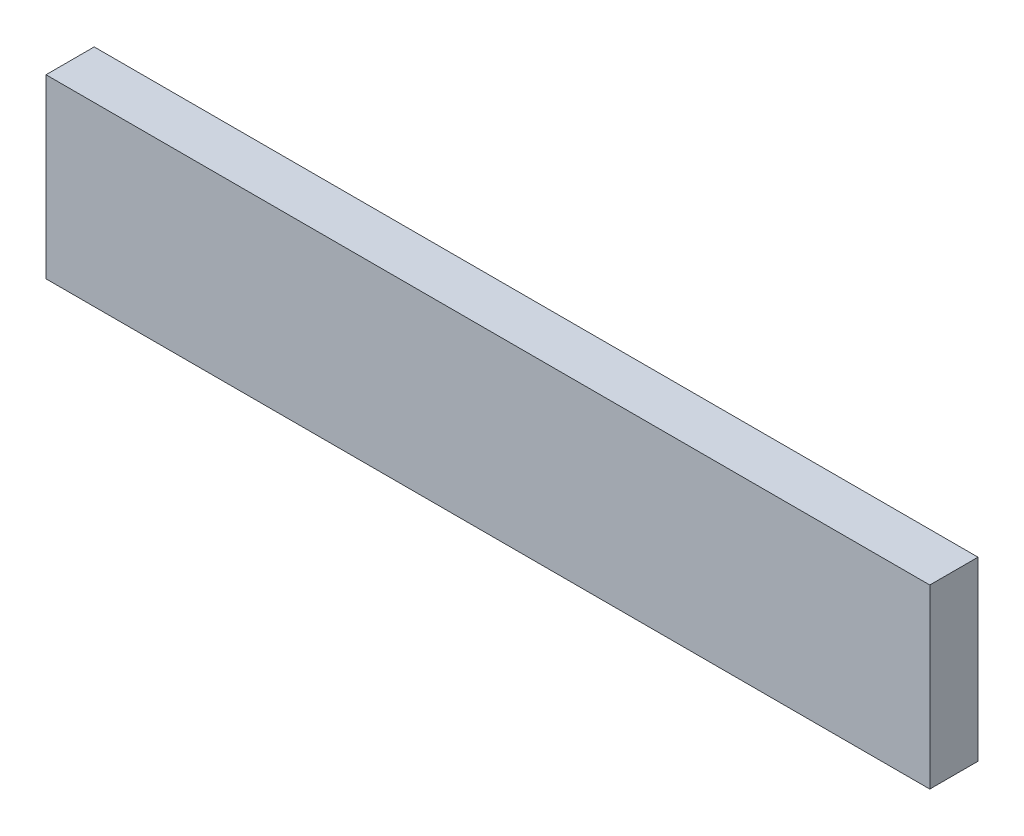
ISO-10303-21;
HEADER;
FILE_DESCRIPTION(('STEP AP214'),'2;1');
FILE_NAME('part.step','',(''),(''),'','','');
FILE_SCHEMA(('AUTOMOTIVE_DESIGN { 1 0 10303 214 1 1 1 1 }'));
ENDSEC;
DATA;
#1=APPLICATION_CONTEXT('core data for automotive mechanical design processes');
#2=APPLICATION_PROTOCOL_DEFINITION('international standard','automotive_design',2000,#1);
#3=PRODUCT_CONTEXT('',#1,'mechanical');
#4=PRODUCT('Part','Part','',(#3));
#5=PRODUCT_RELATED_PRODUCT_CATEGORY('part','',(#4));
#6=PRODUCT_DEFINITION_FORMATION('','',#4);
#7=PRODUCT_DEFINITION_CONTEXT('part definition',#1,'design');
#8=PRODUCT_DEFINITION('design','',#6,#7);
#9=PRODUCT_DEFINITION_SHAPE('','',#8);
#10=(LENGTH_UNIT() NAMED_UNIT(*) SI_UNIT(.MILLI.,.METRE.));
#11=(NAMED_UNIT(*) PLANE_ANGLE_UNIT() SI_UNIT($,.RADIAN.));
#12=(NAMED_UNIT(*) SI_UNIT($,.STERADIAN.) SOLID_ANGLE_UNIT());
#13=UNCERTAINTY_MEASURE_WITH_UNIT(LENGTH_MEASURE(1.E-05),#10,'distance_accuracy_value','');
#14=(GEOMETRIC_REPRESENTATION_CONTEXT(3) GLOBAL_UNCERTAINTY_ASSIGNED_CONTEXT((#13)) GLOBAL_UNIT_ASSIGNED_CONTEXT((#10,
#11,#12)) REPRESENTATION_CONTEXT('',''));
#15=CARTESIAN_POINT('',(0.,0.,0.));
#16=DIRECTION('',(0.,0.,1.));
#17=DIRECTION('',(1.,0.,0.));
#18=AXIS2_PLACEMENT_3D('',#15,#16,#17);
#19=CARTESIAN_POINT('',(0.,0.,3.));
#20=DIRECTION('',(1.,0.,0.));
#21=DIRECTION('',(0.,0.,-1.));
#22=AXIS2_PLACEMENT_3D('',#19,#20,#21);
#23=PLANE('',#22);
#24=DIRECTION('',(0.,-1.,0.));
#25=VECTOR('',#24,1.);
#26=CARTESIAN_POINT('',(0.,0.,0.));
#27=LINE('',#26,#25);
#28=CARTESIAN_POINT('',(0.,11.,0.));
#29=VERTEX_POINT('',#28);
#30=CARTESIAN_POINT('',(0.,0.,0.));
#31=VERTEX_POINT('',#30);
#32=EDGE_CURVE('E98',#29,#31,#27,.T.);
#33=ORIENTED_EDGE('',*,*,#32,.T.);
#34=DIRECTION('',(0.,0.,-1.));
#35=VECTOR('',#34,1.);
#36=CARTESIAN_POINT('',(0.,0.,3.));
#37=LINE('',#36,#35);
#38=CARTESIAN_POINT('',(0.,0.,3.));
#39=VERTEX_POINT('',#38);
#40=EDGE_CURVE('E11',#39,#31,#37,.T.);
#41=ORIENTED_EDGE('',*,*,#40,.F.);
#42=DIRECTION('',(0.,-1.,0.));
#43=VECTOR('',#42,1.);
#44=CARTESIAN_POINT('',(0.,0.,3.));
#45=LINE('',#44,#43);
#46=CARTESIAN_POINT('',(0.,11.,3.));
#47=VERTEX_POINT('',#46);
#48=EDGE_CURVE('E86',#47,#39,#45,.T.);
#49=ORIENTED_EDGE('',*,*,#48,.F.);
#50=DIRECTION('',(0.,0.,-1.));
#51=VECTOR('',#50,1.);
#52=CARTESIAN_POINT('',(0.,11.,3.));
#53=LINE('',#52,#51);
#54=EDGE_CURVE('E94',#47,#29,#53,.T.);
#55=ORIENTED_EDGE('',*,*,#54,.T.);
#56=EDGE_LOOP('',(#33,#41,#49,#55));
#57=FACE_BOUND('',#56,.T.);
#58=ADVANCED_FACE('F35',(#57),#23,.F.);
#59=CARTESIAN_POINT('',(0.,0.,3.));
#60=DIRECTION('',(0.,1.,0.));
#61=DIRECTION('',(0.,0.,1.));
#62=AXIS2_PLACEMENT_3D('',#59,#60,#61);
#63=PLANE('',#62);
#64=DIRECTION('',(1.,0.,0.));
#65=VECTOR('',#64,1.);
#66=CARTESIAN_POINT('',(0.,0.,0.));
#67=LINE('',#66,#65);
#68=CARTESIAN_POINT('',(55.,0.,0.));
#69=VERTEX_POINT('',#68);
#70=EDGE_CURVE('E90',#31,#69,#67,.T.);
#71=ORIENTED_EDGE('',*,*,#70,.T.);
#72=DIRECTION('',(0.,0.,-1.));
#73=VECTOR('',#72,1.);
#74=CARTESIAN_POINT('',(55.,0.,3.));
#75=LINE('',#74,#73);
#76=CARTESIAN_POINT('',(55.,0.,3.));
#77=VERTEX_POINT('',#76);
#78=EDGE_CURVE('E43',#77,#69,#75,.T.);
#79=ORIENTED_EDGE('',*,*,#78,.F.);
#80=DIRECTION('',(1.,0.,0.));
#81=VECTOR('',#80,1.);
#82=CARTESIAN_POINT('',(0.,0.,3.));
#83=LINE('',#82,#81);
#84=EDGE_CURVE('E81',#39,#77,#83,.T.);
#85=ORIENTED_EDGE('',*,*,#84,.F.);
#86=ORIENTED_EDGE('',*,*,#40,.T.);
#87=EDGE_LOOP('',(#71,#79,#85,#86));
#88=FACE_BOUND('',#87,.T.);
#89=ADVANCED_FACE('F89',(#88),#63,.F.);
#90=CARTESIAN_POINT('',(55.,0.,3.));
#91=DIRECTION('',(-1.,0.,0.));
#92=DIRECTION('',(0.,0.,1.));
#93=AXIS2_PLACEMENT_3D('',#90,#91,#92);
#94=PLANE('',#93);
#95=DIRECTION('',(0.,1.,0.));
#96=VECTOR('',#95,1.);
#97=CARTESIAN_POINT('',(55.,0.,0.));
#98=LINE('',#97,#96);
#99=CARTESIAN_POINT('',(55.,11.,0.));
#100=VERTEX_POINT('',#99);
#101=EDGE_CURVE('E68',#69,#100,#98,.T.);
#102=ORIENTED_EDGE('',*,*,#101,.T.);
#103=DIRECTION('',(0.,0.,-1.));
#104=VECTOR('',#103,1.);
#105=CARTESIAN_POINT('',(55.,11.,3.));
#106=LINE('',#105,#104);
#107=CARTESIAN_POINT('',(55.,11.,3.));
#108=VERTEX_POINT('',#107);
#109=EDGE_CURVE('E91',#108,#100,#106,.T.);
#110=ORIENTED_EDGE('',*,*,#109,.F.);
#111=DIRECTION('',(0.,1.,0.));
#112=VECTOR('',#111,1.);
#113=CARTESIAN_POINT('',(55.,0.,3.));
#114=LINE('',#113,#112);
#115=EDGE_CURVE('E84',#77,#108,#114,.T.);
#116=ORIENTED_EDGE('',*,*,#115,.F.);
#117=ORIENTED_EDGE('',*,*,#78,.T.);
#118=EDGE_LOOP('',(#102,#110,#116,#117));
#119=FACE_BOUND('',#118,.T.);
#120=ADVANCED_FACE('F92',(#119),#94,.F.);
#121=CARTESIAN_POINT('',(0.,11.,3.));
#122=DIRECTION('',(0.,-1.,0.));
#123=DIRECTION('',(0.,0.,-1.));
#124=AXIS2_PLACEMENT_3D('',#121,#122,#123);
#125=PLANE('',#124);
#126=DIRECTION('',(-1.,0.,0.));
#127=VECTOR('',#126,1.);
#128=CARTESIAN_POINT('',(0.,11.,0.));
#129=LINE('',#128,#127);
#130=EDGE_CURVE('E74',#100,#29,#129,.T.);
#131=ORIENTED_EDGE('',*,*,#130,.T.);
#132=ORIENTED_EDGE('',*,*,#54,.F.);
#133=DIRECTION('',(-1.,0.,0.));
#134=VECTOR('',#133,1.);
#135=CARTESIAN_POINT('',(0.,11.,3.));
#136=LINE('',#135,#134);
#137=EDGE_CURVE('E51',#108,#47,#136,.T.);
#138=ORIENTED_EDGE('',*,*,#137,.F.);
#139=ORIENTED_EDGE('',*,*,#109,.T.);
#140=EDGE_LOOP('',(#131,#132,#138,#139));
#141=FACE_BOUND('',#140,.T.);
#142=ADVANCED_FACE('F105',(#141),#125,.F.);
#143=CARTESIAN_POINT('',(0.,0.,3.));
#144=DIRECTION('',(0.,0.,-1.));
#145=DIRECTION('',(-1.,0.,0.));
#146=AXIS2_PLACEMENT_3D('',#143,#144,#145);
#147=PLANE('',#146);
#148=ORIENTED_EDGE('',*,*,#48,.T.);
#149=ORIENTED_EDGE('',*,*,#84,.T.);
#150=ORIENTED_EDGE('',*,*,#115,.T.);
#151=ORIENTED_EDGE('',*,*,#137,.T.);
#152=EDGE_LOOP('',(#148,#149,#150,#151));
#153=FACE_BOUND('',#152,.T.);
#154=ADVANCED_FACE('F82',(#153),#147,.F.);
#155=CARTESIAN_POINT('',(0.,0.,0.));
#156=DIRECTION('',(0.,0.,-1.));
#157=DIRECTION('',(-1.,0.,0.));
#158=AXIS2_PLACEMENT_3D('',#155,#156,#157);
#159=PLANE('',#158);
#160=ORIENTED_EDGE('',*,*,#32,.F.);
#161=ORIENTED_EDGE('',*,*,#130,.F.);
#162=ORIENTED_EDGE('',*,*,#101,.F.);
#163=ORIENTED_EDGE('',*,*,#70,.F.);
#164=EDGE_LOOP('',(#160,#161,#162,#163));
#165=FACE_BOUND('',#164,.T.);
#166=ADVANCED_FACE('F108',(#165),#159,.T.);
#167=CLOSED_SHELL('',(#58,#89,#120,#142,#154,#166));
#168=MANIFOLD_SOLID_BREP('B2',#167);
#169=ADVANCED_BREP_SHAPE_REPRESENTATION('',(#18,#168),#14);
#170=SHAPE_DEFINITION_REPRESENTATION(#9,#169);
ENDSEC;
END-ISO-10303-21;
